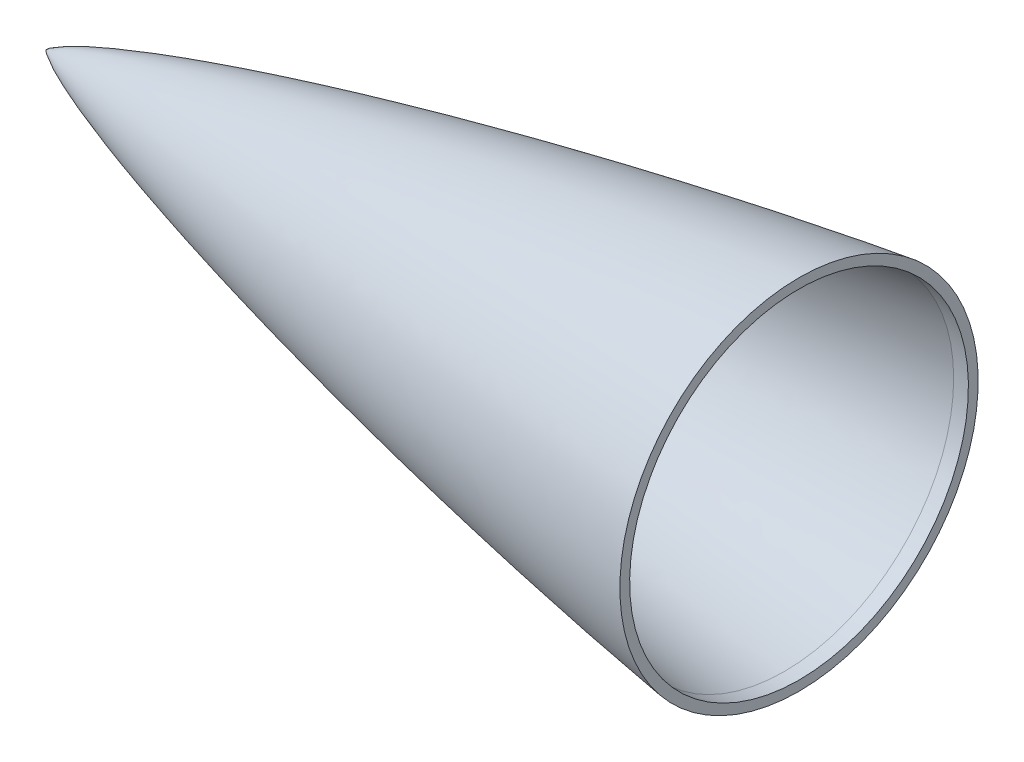
ISO-10303-21;
HEADER;
FILE_DESCRIPTION(('STEP AP214'),'2;1');
FILE_NAME('part.step','',(''),(''),'','','');
FILE_SCHEMA(('AUTOMOTIVE_DESIGN { 1 0 10303 214 1 1 1 1 }'));
ENDSEC;
DATA;
#1=APPLICATION_CONTEXT('core data for automotive mechanical design processes');
#2=APPLICATION_PROTOCOL_DEFINITION('international standard','automotive_design',2000,#1);
#3=PRODUCT_CONTEXT('',#1,'mechanical');
#4=PRODUCT('Part','Part','',(#3));
#5=PRODUCT_RELATED_PRODUCT_CATEGORY('part','',(#4));
#6=PRODUCT_DEFINITION_FORMATION('','',#4);
#7=PRODUCT_DEFINITION_CONTEXT('part definition',#1,'design');
#8=PRODUCT_DEFINITION('design','',#6,#7);
#9=PRODUCT_DEFINITION_SHAPE('','',#8);
#10=(LENGTH_UNIT() NAMED_UNIT(*) SI_UNIT(.MILLI.,.METRE.));
#11=(NAMED_UNIT(*) PLANE_ANGLE_UNIT() SI_UNIT($,.RADIAN.));
#12=(NAMED_UNIT(*) SI_UNIT($,.STERADIAN.) SOLID_ANGLE_UNIT());
#13=UNCERTAINTY_MEASURE_WITH_UNIT(LENGTH_MEASURE(1.E-05),#10,'distance_accuracy_value','');
#14=(GEOMETRIC_REPRESENTATION_CONTEXT(3) GLOBAL_UNCERTAINTY_ASSIGNED_CONTEXT((#13)) GLOBAL_UNIT_ASSIGNED_CONTEXT((#10,
#11,#12)) REPRESENTATION_CONTEXT('',''));
#15=CARTESIAN_POINT('',(0.,0.,0.));
#16=DIRECTION('',(0.,0.,1.));
#17=DIRECTION('',(1.,0.,0.));
#18=AXIS2_PLACEMENT_3D('',#15,#16,#17);
#19=CARTESIAN_POINT('',(0.,53.975,0.));
#20=CARTESIAN_POINT('',(-0.762577839159562,53.9243624643576,0.));
#21=CARTESIAN_POINT('',(-2.2866229473468,53.8072351952309,0.));
#22=CARTESIAN_POINT('',(-5.33283788636391,53.5501900062193,0.));
#23=CARTESIAN_POINT('',(-12.3826319480392,52.8765626514317,0.));
#24=CARTESIAN_POINT('',(-22.6624918106674,51.7379446619337,0.));
#25=CARTESIAN_POINT('',(-36.158776733577,50.0351883741204,0.));
#26=CARTESIAN_POINT('',(-52.1001453335647,47.7848516970836,0.));
#27=CARTESIAN_POINT('',(-68.0120902289548,45.3359822740422,0.));
#28=CARTESIAN_POINT('',(-83.8953812982109,42.7078703398633,0.));
#29=CARTESIAN_POINT('',(-99.7498666657499,39.9114858337382,0.));
#30=CARTESIAN_POINT('',(-115.574626381457,36.9514313463357,0.));
#31=CARTESIAN_POINT('',(-131.367811003531,33.8273727835164,0.));
#32=CARTESIAN_POINT('',(-147.126695193497,30.5343257835923,0.));
#33=CARTESIAN_POINT('',(-162.846877025473,27.0612234380546,0.));
#34=CARTESIAN_POINT('',(-178.522260829731,23.3903987599354,0.));
#35=CARTESIAN_POINT('',(-194.142449172236,19.4911646768542,0.));
#36=CARTESIAN_POINT('',(-209.543049516986,15.3553383678695,0.));
#37=CARTESIAN_POINT('',(-222.911428453938,11.4247475119156,0.));
#38=CARTESIAN_POINT('',(-233.608490935743,7.93142716849099,0.));
#39=CARTESIAN_POINT('',(-241.112112642419,5.14614913947575,0.));
#40=CARTESIAN_POINT('',(-245.183492013607,3.43977584674955,0.));
#41=CARTESIAN_POINT('',(-247.354124560049,2.41233101607387,0.));
#42=CARTESIAN_POINT('',(-248.293732838986,1.92511849843724,0.));
#43=CARTESIAN_POINT('',(-248.542466659522,1.7922193755323,0.));
#44=B_SPLINE_CURVE_WITH_KNOTS('',4,(#19,#20,#21,#22,#23,#24,#25,#26,#27,#28,#29,#30,#31,#32,#33,
#34,#35,#36,#37,#38,#39,#40,#41,#42,#43),.UNSPECIFIED.,.F.,.F.,(5,1,1,1,1,1,1,1,1,1,1,1,1,1,1,1,
1,1,1,1,1,5),(0.,0.0118578432680473,0.0237156865360946,0.0474313730721893,0.10987754798774,
0.172323723416681,0.234769900121104,0.297216073556211,0.359662248910283,0.422108423884707,
0.484554599365608,0.547000772902664,0.609446948301888,0.671893123997519,0.734339297931479,
0.796785468432099,0.859231646299098,0.9192908135299,0.950513830207713,0.971341918143476,
0.983386684200627,0.987762236201747),.UNSPECIFIED.);
#45=CARTESIAN_POINT('',(-251.106171519141,0.,0.));
#46=DIRECTION('',(-1.,0.,0.));
#47=AXIS1_PLACEMENT('',#45,#46);
#48=SURFACE_OF_REVOLUTION('',#44,#47);
#49=OFFSET_SURFACE('',#48,-2.032,.F.);
#50=CARTESIAN_POINT('',(-247.584879217057,0.,0.));
#51=VERTEX_POINT('',#50);
#52=VERTEX_LOOP('',#51);
#53=FACE_BOUND('',#52,.T.);
#54=CARTESIAN_POINT('',(-51.8869694502103,0.,0.));
#55=DIRECTION('',(-1.,0.,0.));
#56=DIRECTION('',(0.,-1.,0.));
#57=AXIS2_PLACEMENT_3D('',#54,#55,#56);
#58=CIRCLE('',#57,45.72);
#59=CARTESIAN_POINT('',(-51.8869694502103,-45.72,0.));
#60=VERTEX_POINT('',#59);
#61=EDGE_CURVE('E11',#60,#60,#58,.F.);
#62=ORIENTED_EDGE('',*,*,#61,.T.);
#63=EDGE_LOOP('',(#62));
#64=FACE_BOUND('',#63,.T.);
#65=ADVANCED_FACE('F44',(#53,#64),#49,.F.);
#66=CARTESIAN_POINT('',(-263.661480095098,0.,0.));
#67=DIRECTION('',(-1.,0.,0.));
#68=DIRECTION('',(0.,0.,1.));
#69=AXIS2_PLACEMENT_3D('',#66,#67,#68);
#70=CYLINDRICAL_SURFACE('',#69,45.72);
#71=CARTESIAN_POINT('',(-47.9061715191405,0.,0.));
#72=DIRECTION('',(-1.,0.,0.));
#73=DIRECTION('',(0.,-1.,0.));
#74=AXIS2_PLACEMENT_3D('',#71,#72,#73);
#75=CIRCLE('',#74,45.72);
#76=CARTESIAN_POINT('',(-47.9061715191405,-45.72,0.));
#77=VERTEX_POINT('',#76);
#78=EDGE_CURVE('E49',#77,#77,#75,.F.);
#79=ORIENTED_EDGE('',*,*,#78,.T.);
#80=EDGE_LOOP('',(#79));
#81=FACE_BOUND('',#80,.T.);
#82=ORIENTED_EDGE('',*,*,#61,.F.);
#83=EDGE_LOOP('',(#82));
#84=FACE_BOUND('',#83,.T.);
#85=ADVANCED_FACE('F63',(#81,#84),#70,.F.);
#86=CARTESIAN_POINT('',(-47.9061715191405,96.1545584324061,-53.975));
#87=DIRECTION('',(-1.,0.,0.));
#88=DIRECTION('',(0.,-1.,0.));
#89=AXIS2_PLACEMENT_3D('',#86,#87,#88);
#90=PLANE('',#89);
#91=ORIENTED_EDGE('',*,*,#78,.F.);
#92=EDGE_LOOP('',(#91));
#93=FACE_BOUND('',#92,.T.);
#94=CARTESIAN_POINT('',(-47.9061715191405,0.,0.));
#95=DIRECTION('',(-1.,0.,0.));
#96=DIRECTION('',(0.,-1.,0.));
#97=AXIS2_PLACEMENT_3D('',#94,#95,#96);
#98=CIRCLE('',#97,48.353780371622);
#99=CARTESIAN_POINT('',(-47.9061715191405,-48.353780371622,0.));
#100=VERTEX_POINT('',#99);
#101=EDGE_CURVE('E55',#100,#100,#98,.T.);
#102=ORIENTED_EDGE('',*,*,#101,.F.);
#103=EDGE_LOOP('',(#102));
#104=FACE_BOUND('',#103,.T.);
#105=ADVANCED_FACE('F68',(#93,#104),#90,.F.);
#106=CARTESIAN_POINT('',(0.,53.975,0.));
#107=CARTESIAN_POINT('',(-0.762577839159562,53.9243624643576,0.));
#108=CARTESIAN_POINT('',(-2.2866229473468,53.8072351952309,0.));
#109=CARTESIAN_POINT('',(-5.33283788636391,53.5501900062193,0.));
#110=CARTESIAN_POINT('',(-12.3826319480392,52.8765626514317,0.));
#111=CARTESIAN_POINT('',(-22.6624918106674,51.7379446619337,0.));
#112=CARTESIAN_POINT('',(-36.158776733577,50.0351883741204,0.));
#113=CARTESIAN_POINT('',(-52.1001453335647,47.7848516970836,0.));
#114=CARTESIAN_POINT('',(-68.0120902289548,45.3359822740422,0.));
#115=CARTESIAN_POINT('',(-83.8953812982109,42.7078703398633,0.));
#116=CARTESIAN_POINT('',(-99.7498666657499,39.9114858337382,0.));
#117=CARTESIAN_POINT('',(-115.574626381457,36.9514313463357,0.));
#118=CARTESIAN_POINT('',(-131.367811003531,33.8273727835164,0.));
#119=CARTESIAN_POINT('',(-147.126695193497,30.5343257835923,0.));
#120=CARTESIAN_POINT('',(-162.846877025473,27.0612234380546,0.));
#121=CARTESIAN_POINT('',(-178.522260829731,23.3903987599354,0.));
#122=CARTESIAN_POINT('',(-194.142449172236,19.4911646768542,0.));
#123=CARTESIAN_POINT('',(-209.543049516986,15.3553383678695,0.));
#124=CARTESIAN_POINT('',(-222.911428453938,11.4247475119156,0.));
#125=CARTESIAN_POINT('',(-233.608490935743,7.93142716849099,0.));
#126=CARTESIAN_POINT('',(-241.112112642419,5.14614913947575,0.));
#127=CARTESIAN_POINT('',(-245.316381441755,3.38407998782701,0.));
#128=CARTESIAN_POINT('',(-247.831421195945,2.18525440433127,0.));
#129=CARTESIAN_POINT('',(-249.226080906954,1.42828585042156,0.));
#130=CARTESIAN_POINT('',(-249.987647372951,0.961070946618688,0.));
#131=CARTESIAN_POINT('',(-250.418448621032,0.664095217063808,0.));
#132=CARTESIAN_POINT('',(-250.672702773937,0.468410134860955,0.));
#133=CARTESIAN_POINT('',(-250.821870390534,0.340834464140859,0.));
#134=CARTESIAN_POINT('',(-250.917840301397,0.250186666783767,0.));
#135=CARTESIAN_POINT('',(-250.98627542219,0.178864698228604,0.));
#136=CARTESIAN_POINT('',(-251.033647044312,0.124131206934188,0.));
#137=CARTESIAN_POINT('',(-251.072144667075,0.0721489688722855,0.));
#138=CARTESIAN_POINT('',(-251.095734382592,0.0326008361651066,0.));
#139=CARTESIAN_POINT('',(-251.103398531596,0.0111452663531623,0.));
#140=CARTESIAN_POINT('',(-251.106171519141,0.,0.));
#141=B_SPLINE_CURVE_WITH_KNOTS('',4,(#106,#107,#108,#109,#110,#111,#112,#113,#114,#115,#116,
#117,#118,#119,#120,#121,#122,#123,#124,#125,#126,#127,#128,#129,#130,#131,#132,#133,#134,#135,
#136,#137,#138,#139,#140),.UNSPECIFIED.,.F.,.F.,(5,1,1,1,1,1,1,1,1,1,1,1,1,1,1,1,1,1,1,1,1,1,1,
1,1,1,1,1,1,1,1,5),(0.,0.0118578432680473,0.0237156865360946,0.0474313730721893,
0.10987754798774,0.172323723416681,0.234769900121104,0.297216073556211,0.359662248910283,
0.422108423884707,0.484554599365608,0.547000772902664,0.609446948301888,0.671893123997519,
0.734339297931479,0.796785468432099,0.859231646299098,0.9192908135299,0.950513830207713,
0.971341918143476,0.983386684200627,0.989997136802696,0.993725107542949,0.99595175320143,
0.997243318771063,0.998111805935774,0.998701124711282,0.998995879989268,0.999290635267254,
0.999645317633627,0.999822658816814,1.),.UNSPECIFIED.);
#142=CARTESIAN_POINT('',(-251.106171519141,0.,0.));
#143=DIRECTION('',(-1.,0.,0.));
#144=AXIS1_PLACEMENT('',#142,#143);
#145=SURFACE_OF_REVOLUTION('',#141,#144);
#146=ORIENTED_EDGE('',*,*,#101,.T.);
#147=EDGE_LOOP('',(#146));
#148=FACE_BOUND('',#147,.T.);
#149=CARTESIAN_POINT('',(-251.106171519141,0.,0.));
#150=VERTEX_POINT('',#149);
#151=VERTEX_LOOP('',#150);
#152=FACE_BOUND('',#151,.T.);
#153=ADVANCED_FACE('F46',(#148,#152),#145,.T.);
#154=CLOSED_SHELL('',(#65,#85,#105,#153));
#155=MANIFOLD_SOLID_BREP('B2',#154);
#156=ADVANCED_BREP_SHAPE_REPRESENTATION('',(#18,#155),#14);
#157=SHAPE_DEFINITION_REPRESENTATION(#9,#156);
ENDSEC;
END-ISO-10303-21;
